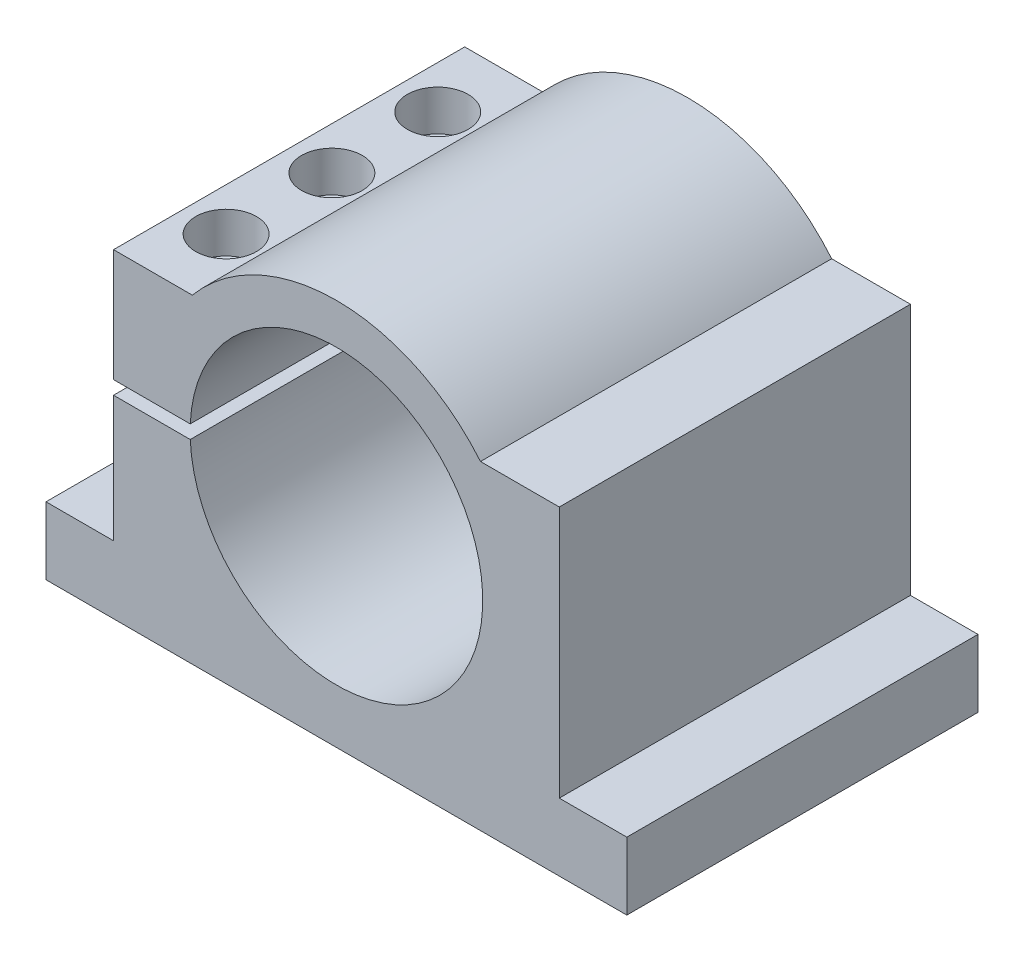
ISO-10303-21;
HEADER;
FILE_DESCRIPTION(('STEP AP214'),'2;1');
FILE_NAME('part.step','',(''),(''),'','','');
FILE_SCHEMA(('AUTOMOTIVE_DESIGN { 1 0 10303 214 1 1 1 1 }'));
ENDSEC;
DATA;
#1=APPLICATION_CONTEXT('core data for automotive mechanical design processes');
#2=APPLICATION_PROTOCOL_DEFINITION('international standard','automotive_design',2000,#1);
#3=PRODUCT_CONTEXT('',#1,'mechanical');
#4=PRODUCT('Part','Part','',(#3));
#5=PRODUCT_RELATED_PRODUCT_CATEGORY('part','',(#4));
#6=PRODUCT_DEFINITION_FORMATION('','',#4);
#7=PRODUCT_DEFINITION_CONTEXT('part definition',#1,'design');
#8=PRODUCT_DEFINITION('design','',#6,#7);
#9=PRODUCT_DEFINITION_SHAPE('','',#8);
#10=(LENGTH_UNIT() NAMED_UNIT(*) SI_UNIT(.MILLI.,.METRE.));
#11=(NAMED_UNIT(*) PLANE_ANGLE_UNIT() SI_UNIT($,.RADIAN.));
#12=(NAMED_UNIT(*) SI_UNIT($,.STERADIAN.) SOLID_ANGLE_UNIT());
#13=UNCERTAINTY_MEASURE_WITH_UNIT(LENGTH_MEASURE(1.E-05),#10,'distance_accuracy_value','');
#14=(GEOMETRIC_REPRESENTATION_CONTEXT(3) GLOBAL_UNCERTAINTY_ASSIGNED_CONTEXT((#13)) GLOBAL_UNIT_ASSIGNED_CONTEXT((#10,
#11,#12)) REPRESENTATION_CONTEXT('',''));
#15=CARTESIAN_POINT('',(0.,0.,0.));
#16=DIRECTION('',(0.,0.,1.));
#17=DIRECTION('',(1.,0.,0.));
#18=AXIS2_PLACEMENT_3D('',#15,#16,#17);
#19=CARTESIAN_POINT('',(-64.5,0.,78.));
#20=DIRECTION('',(1.,0.,0.));
#21=DIRECTION('',(0.,0.,-1.));
#22=AXIS2_PLACEMENT_3D('',#19,#20,#21);
#23=PLANE('',#22);
#24=DIRECTION('',(0.,-1.,0.));
#25=VECTOR('',#24,1.);
#26=CARTESIAN_POINT('',(-64.5,0.,0.));
#27=LINE('',#26,#25);
#28=CARTESIAN_POINT('',(-64.5,15.,0.));
#29=VERTEX_POINT('',#28);
#30=CARTESIAN_POINT('',(-64.5,0.,0.));
#31=VERTEX_POINT('',#30);
#32=EDGE_CURVE('E174',#29,#31,#27,.T.);
#33=ORIENTED_EDGE('',*,*,#32,.T.);
#34=DIRECTION('',(0.,0.,-1.));
#35=VECTOR('',#34,1.);
#36=CARTESIAN_POINT('',(-64.5,0.,78.));
#37=LINE('',#36,#35);
#38=CARTESIAN_POINT('',(-64.5,0.,78.));
#39=VERTEX_POINT('',#38);
#40=EDGE_CURVE('E11',#39,#31,#37,.T.);
#41=ORIENTED_EDGE('',*,*,#40,.F.);
#42=DIRECTION('',(0.,-1.,0.));
#43=VECTOR('',#42,1.);
#44=CARTESIAN_POINT('',(-64.5,0.,78.));
#45=LINE('',#44,#43);
#46=CARTESIAN_POINT('',(-64.5,15.,78.));
#47=VERTEX_POINT('',#46);
#48=EDGE_CURVE('E201',#47,#39,#45,.T.);
#49=ORIENTED_EDGE('',*,*,#48,.F.);
#50=DIRECTION('',(0.,0.,-1.));
#51=VECTOR('',#50,1.);
#52=CARTESIAN_POINT('',(-64.5,15.,78.));
#53=LINE('',#52,#51);
#54=EDGE_CURVE('E170',#47,#29,#53,.T.);
#55=ORIENTED_EDGE('',*,*,#54,.T.);
#56=EDGE_LOOP('',(#33,#41,#49,#55));
#57=FACE_BOUND('',#56,.T.);
#58=ADVANCED_FACE('F38',(#57),#23,.F.);
#59=CARTESIAN_POINT('',(-64.5,0.,78.));
#60=DIRECTION('',(0.,1.,0.));
#61=DIRECTION('',(-1.,0.,0.));
#62=AXIS2_PLACEMENT_3D('',#59,#60,#61);
#63=PLANE('',#62);
#64=DIRECTION('',(1.,0.,0.));
#65=VECTOR('',#64,1.);
#66=CARTESIAN_POINT('',(-64.5,0.,0.));
#67=LINE('',#66,#65);
#68=CARTESIAN_POINT('',(64.5,0.,0.));
#69=VERTEX_POINT('',#68);
#70=EDGE_CURVE('E177',#31,#69,#67,.T.);
#71=ORIENTED_EDGE('',*,*,#70,.T.);
#72=DIRECTION('',(0.,0.,-1.));
#73=VECTOR('',#72,1.);
#74=CARTESIAN_POINT('',(64.5,0.,78.));
#75=LINE('',#74,#73);
#76=CARTESIAN_POINT('',(64.5,0.,78.));
#77=VERTEX_POINT('',#76);
#78=EDGE_CURVE('E47',#77,#69,#75,.T.);
#79=ORIENTED_EDGE('',*,*,#78,.F.);
#80=DIRECTION('',(1.,0.,0.));
#81=VECTOR('',#80,1.);
#82=CARTESIAN_POINT('',(-64.5,0.,78.));
#83=LINE('',#82,#81);
#84=EDGE_CURVE('E117',#39,#77,#83,.T.);
#85=ORIENTED_EDGE('',*,*,#84,.F.);
#86=ORIENTED_EDGE('',*,*,#40,.T.);
#87=EDGE_LOOP('',(#71,#79,#85,#86));
#88=FACE_BOUND('',#87,.T.);
#89=ADVANCED_FACE('F290',(#88),#63,.F.);
#90=CARTESIAN_POINT('',(64.5,0.,78.));
#91=DIRECTION('',(-1.,0.,0.));
#92=DIRECTION('',(0.,0.,1.));
#93=AXIS2_PLACEMENT_3D('',#90,#91,#92);
#94=PLANE('',#93);
#95=DIRECTION('',(0.,1.,0.));
#96=VECTOR('',#95,1.);
#97=CARTESIAN_POINT('',(64.5,0.,0.));
#98=LINE('',#97,#96);
#99=CARTESIAN_POINT('',(64.5,15.,0.));
#100=VERTEX_POINT('',#99);
#101=EDGE_CURVE('E180',#69,#100,#98,.T.);
#102=ORIENTED_EDGE('',*,*,#101,.T.);
#103=DIRECTION('',(0.,0.,-1.));
#104=VECTOR('',#103,1.);
#105=CARTESIAN_POINT('',(64.5,15.,78.));
#106=LINE('',#105,#104);
#107=CARTESIAN_POINT('',(64.5,15.,78.));
#108=VERTEX_POINT('',#107);
#109=EDGE_CURVE('E226',#108,#100,#106,.T.);
#110=ORIENTED_EDGE('',*,*,#109,.F.);
#111=DIRECTION('',(0.,1.,0.));
#112=VECTOR('',#111,1.);
#113=CARTESIAN_POINT('',(64.5,0.,78.));
#114=LINE('',#113,#112);
#115=EDGE_CURVE('E235',#77,#108,#114,.T.);
#116=ORIENTED_EDGE('',*,*,#115,.F.);
#117=ORIENTED_EDGE('',*,*,#78,.T.);
#118=EDGE_LOOP('',(#102,#110,#116,#117));
#119=FACE_BOUND('',#118,.T.);
#120=ADVANCED_FACE('F233',(#119),#94,.F.);
#121=CARTESIAN_POINT('',(64.5,15.,78.));
#122=DIRECTION('',(0.,-1.,0.));
#123=DIRECTION('',(1.,0.,0.));
#124=AXIS2_PLACEMENT_3D('',#121,#122,#123);
#125=PLANE('',#124);
#126=DIRECTION('',(-1.,0.,0.));
#127=VECTOR('',#126,1.);
#128=CARTESIAN_POINT('',(64.5,15.,0.));
#129=LINE('',#128,#127);
#130=CARTESIAN_POINT('',(49.5,15.,0.));
#131=VERTEX_POINT('',#130);
#132=EDGE_CURVE('E182',#100,#131,#129,.T.);
#133=ORIENTED_EDGE('',*,*,#132,.T.);
#134=DIRECTION('',(0.,0.,-1.));
#135=VECTOR('',#134,1.);
#136=CARTESIAN_POINT('',(49.5,15.,78.));
#137=LINE('',#136,#135);
#138=CARTESIAN_POINT('',(49.5,15.,78.));
#139=VERTEX_POINT('',#138);
#140=EDGE_CURVE('E223',#139,#131,#137,.T.);
#141=ORIENTED_EDGE('',*,*,#140,.F.);
#142=DIRECTION('',(-1.,0.,0.));
#143=VECTOR('',#142,1.);
#144=CARTESIAN_POINT('',(64.5,15.,78.));
#145=LINE('',#144,#143);
#146=EDGE_CURVE('E253',#108,#139,#145,.T.);
#147=ORIENTED_EDGE('',*,*,#146,.F.);
#148=ORIENTED_EDGE('',*,*,#109,.T.);
#149=EDGE_LOOP('',(#133,#141,#147,#148));
#150=FACE_BOUND('',#149,.T.);
#151=ADVANCED_FACE('F244',(#150),#125,.F.);
#152=CARTESIAN_POINT('',(49.5,15.,78.));
#153=DIRECTION('',(-1.,0.,0.));
#154=DIRECTION('',(0.,-1.,0.));
#155=AXIS2_PLACEMENT_3D('',#152,#153,#154);
#156=PLANE('',#155);
#157=DIRECTION('',(0.,1.,0.));
#158=VECTOR('',#157,1.);
#159=CARTESIAN_POINT('',(49.5,15.,0.));
#160=LINE('',#159,#158);
#161=CARTESIAN_POINT('',(49.5,71.,0.));
#162=VERTEX_POINT('',#161);
#163=EDGE_CURVE('E184',#131,#162,#160,.T.);
#164=ORIENTED_EDGE('',*,*,#163,.T.);
#165=DIRECTION('',(0.,0.,-1.));
#166=VECTOR('',#165,1.);
#167=CARTESIAN_POINT('',(49.5,71.,78.));
#168=LINE('',#167,#166);
#169=CARTESIAN_POINT('',(49.5,71.,78.));
#170=VERTEX_POINT('',#169);
#171=EDGE_CURVE('E220',#170,#162,#168,.T.);
#172=ORIENTED_EDGE('',*,*,#171,.F.);
#173=DIRECTION('',(0.,1.,0.));
#174=VECTOR('',#173,1.);
#175=CARTESIAN_POINT('',(49.5,15.,78.));
#176=LINE('',#175,#174);
#177=EDGE_CURVE('E250',#139,#170,#176,.T.);
#178=ORIENTED_EDGE('',*,*,#177,.F.);
#179=ORIENTED_EDGE('',*,*,#140,.T.);
#180=EDGE_LOOP('',(#164,#172,#178,#179));
#181=FACE_BOUND('',#180,.T.);
#182=ADVANCED_FACE('F248',(#181),#156,.F.);
#183=CARTESIAN_POINT('',(49.5,71.,78.));
#184=DIRECTION('',(0.,-1.,0.));
#185=DIRECTION('',(0.,0.,-1.));
#186=AXIS2_PLACEMENT_3D('',#183,#184,#185);
#187=PLANE('',#186);
#188=DIRECTION('',(-1.,0.,0.));
#189=VECTOR('',#188,1.);
#190=CARTESIAN_POINT('',(49.5,71.,0.));
#191=LINE('',#190,#189);
#192=CARTESIAN_POINT('',(32.,71.,0.));
#193=VERTEX_POINT('',#192);
#194=EDGE_CURVE('E186',#162,#193,#191,.T.);
#195=ORIENTED_EDGE('',*,*,#194,.T.);
#196=DIRECTION('',(0.,0.,-1.));
#197=VECTOR('',#196,1.);
#198=CARTESIAN_POINT('',(32.,71.,78.));
#199=LINE('',#198,#197);
#200=CARTESIAN_POINT('',(32.,71.,78.));
#201=VERTEX_POINT('',#200);
#202=EDGE_CURVE('E217',#201,#193,#199,.T.);
#203=ORIENTED_EDGE('',*,*,#202,.F.);
#204=DIRECTION('',(-1.,0.,0.));
#205=VECTOR('',#204,1.);
#206=CARTESIAN_POINT('',(49.5,71.,78.));
#207=LINE('',#206,#205);
#208=EDGE_CURVE('E252',#170,#201,#207,.T.);
#209=ORIENTED_EDGE('',*,*,#208,.F.);
#210=ORIENTED_EDGE('',*,*,#171,.T.);
#211=EDGE_LOOP('',(#195,#203,#209,#210));
#212=FACE_BOUND('',#211,.T.);
#213=ADVANCED_FACE('F303',(#212),#187,.F.);
#214=CARTESIAN_POINT('',(0.,44.3666666666666,78.));
#215=DIRECTION('',(0.,0.,-1.));
#216=DIRECTION('',(-1.,0.,0.));
#217=AXIS2_PLACEMENT_3D('',#214,#215,#216);
#218=CYLINDRICAL_SURFACE('',#217,41.6333333333334);
#219=CARTESIAN_POINT('',(0.,44.3666666666666,0.));
#220=DIRECTION('',(0.,0.,1.));
#221=DIRECTION('',(-1.,0.,0.));
#222=AXIS2_PLACEMENT_3D('',#219,#220,#221);
#223=CIRCLE('',#222,41.6333333333334);
#224=CARTESIAN_POINT('',(-32.,71.,0.));
#225=VERTEX_POINT('',#224);
#226=EDGE_CURVE('E188',#193,#225,#223,.T.);
#227=ORIENTED_EDGE('',*,*,#226,.T.);
#228=DIRECTION('',(0.,0.,-1.));
#229=VECTOR('',#228,1.);
#230=CARTESIAN_POINT('',(-32.,71.,78.));
#231=LINE('',#230,#229);
#232=CARTESIAN_POINT('',(-32.,71.,78.));
#233=VERTEX_POINT('',#232);
#234=EDGE_CURVE('E214',#233,#225,#231,.T.);
#235=ORIENTED_EDGE('',*,*,#234,.F.);
#236=CARTESIAN_POINT('',(0.,44.3666666666666,78.));
#237=DIRECTION('',(0.,0.,1.));
#238=DIRECTION('',(-1.,0.,0.));
#239=AXIS2_PLACEMENT_3D('',#236,#237,#238);
#240=CIRCLE('',#239,41.6333333333334);
#241=EDGE_CURVE('E255',#201,#233,#240,.T.);
#242=ORIENTED_EDGE('',*,*,#241,.F.);
#243=ORIENTED_EDGE('',*,*,#202,.T.);
#244=EDGE_LOOP('',(#227,#235,#242,#243));
#245=FACE_BOUND('',#244,.T.);
#246=ADVANCED_FACE('F306',(#245),#218,.T.);
#247=CARTESIAN_POINT('',(-49.5,71.,78.));
#248=DIRECTION('',(0.,-1.,0.));
#249=DIRECTION('',(0.,0.,-1.));
#250=AXIS2_PLACEMENT_3D('',#247,#248,#249);
#251=PLANE('',#250);
#252=CARTESIAN_POINT('',(-40.,71.,15.5));
#253=DIRECTION('',(0.,1.,0.));
#254=DIRECTION('',(0.,0.,1.));
#255=AXIS2_PLACEMENT_3D('',#252,#253,#254);
#256=CIRCLE('',#255,6.74999999999999);
#257=CARTESIAN_POINT('',(-40.,71.,22.25));
#258=VERTEX_POINT('',#257);
#259=EDGE_CURVE('E348',#258,#258,#256,.T.);
#260=ORIENTED_EDGE('',*,*,#259,.F.);
#261=EDGE_LOOP('',(#260));
#262=FACE_BOUND('',#261,.T.);
#263=CARTESIAN_POINT('',(-40.,71.,39.));
#264=DIRECTION('',(0.,1.,0.));
#265=DIRECTION('',(0.,0.,1.));
#266=AXIS2_PLACEMENT_3D('',#263,#264,#265);
#267=CIRCLE('',#266,6.74999999999999);
#268=CARTESIAN_POINT('',(-40.,71.,45.75));
#269=VERTEX_POINT('',#268);
#270=EDGE_CURVE('E357',#269,#269,#267,.T.);
#271=ORIENTED_EDGE('',*,*,#270,.F.);
#272=EDGE_LOOP('',(#271));
#273=FACE_BOUND('',#272,.T.);
#274=CARTESIAN_POINT('',(-40.,71.,62.5));
#275=DIRECTION('',(0.,1.,0.));
#276=DIRECTION('',(0.,0.,1.));
#277=AXIS2_PLACEMENT_3D('',#274,#275,#276);
#278=CIRCLE('',#277,6.74999999999999);
#279=CARTESIAN_POINT('',(-40.,71.,69.25));
#280=VERTEX_POINT('',#279);
#281=EDGE_CURVE('E178',#280,#280,#278,.T.);
#282=ORIENTED_EDGE('',*,*,#281,.F.);
#283=EDGE_LOOP('',(#282));
#284=FACE_BOUND('',#283,.T.);
#285=DIRECTION('',(-1.,0.,0.));
#286=VECTOR('',#285,1.);
#287=CARTESIAN_POINT('',(-49.5,71.,0.));
#288=LINE('',#287,#286);
#289=CARTESIAN_POINT('',(-49.5,71.,0.));
#290=VERTEX_POINT('',#289);
#291=EDGE_CURVE('E190',#225,#290,#288,.T.);
#292=ORIENTED_EDGE('',*,*,#291,.T.);
#293=DIRECTION('',(0.,0.,-1.));
#294=VECTOR('',#293,1.);
#295=CARTESIAN_POINT('',(-49.5,71.,78.));
#296=LINE('',#295,#294);
#297=CARTESIAN_POINT('',(-49.5,71.,78.));
#298=VERTEX_POINT('',#297);
#299=EDGE_CURVE('E211',#298,#290,#296,.T.);
#300=ORIENTED_EDGE('',*,*,#299,.F.);
#301=DIRECTION('',(-1.,0.,0.));
#302=VECTOR('',#301,1.);
#303=CARTESIAN_POINT('',(-49.5,71.,78.));
#304=LINE('',#303,#302);
#305=EDGE_CURVE('E261',#233,#298,#304,.T.);
#306=ORIENTED_EDGE('',*,*,#305,.F.);
#307=ORIENTED_EDGE('',*,*,#234,.T.);
#308=EDGE_LOOP('',(#292,#300,#306,#307));
#309=FACE_BOUND('',#308,.T.);
#310=ADVANCED_FACE('F310',(#262,#273,#284,#309),#251,.F.);
#311=CARTESIAN_POINT('',(-49.5,46.,78.));
#312=DIRECTION('',(1.,0.,0.));
#313=DIRECTION('',(0.,1.,0.));
#314=AXIS2_PLACEMENT_3D('',#311,#312,#313);
#315=PLANE('',#314);
#316=DIRECTION('',(0.,-1.,0.));
#317=VECTOR('',#316,1.);
#318=CARTESIAN_POINT('',(-49.5,46.,0.));
#319=LINE('',#318,#317);
#320=CARTESIAN_POINT('',(-49.5,46.,0.));
#321=VERTEX_POINT('',#320);
#322=EDGE_CURVE('E192',#290,#321,#319,.T.);
#323=ORIENTED_EDGE('',*,*,#322,.T.);
#324=DIRECTION('',(0.,0.,-1.));
#325=VECTOR('',#324,1.);
#326=CARTESIAN_POINT('',(-49.5,46.,78.));
#327=LINE('',#326,#325);
#328=CARTESIAN_POINT('',(-49.5,46.,78.));
#329=VERTEX_POINT('',#328);
#330=EDGE_CURVE('E208',#329,#321,#327,.T.);
#331=ORIENTED_EDGE('',*,*,#330,.F.);
#332=DIRECTION('',(0.,-1.,0.));
#333=VECTOR('',#332,1.);
#334=CARTESIAN_POINT('',(-49.5,46.,78.));
#335=LINE('',#334,#333);
#336=EDGE_CURVE('E263',#298,#329,#335,.T.);
#337=ORIENTED_EDGE('',*,*,#336,.F.);
#338=ORIENTED_EDGE('',*,*,#299,.T.);
#339=EDGE_LOOP('',(#323,#331,#337,#338));
#340=FACE_BOUND('',#339,.T.);
#341=ADVANCED_FACE('F314',(#340),#315,.F.);
#342=CARTESIAN_POINT('',(-49.5,46.,78.));
#343=DIRECTION('',(0.,1.,0.));
#344=DIRECTION('',(0.,0.,1.));
#345=AXIS2_PLACEMENT_3D('',#342,#343,#344);
#346=PLANE('',#345);
#347=CARTESIAN_POINT('',(-40.,46.,15.5));
#348=DIRECTION('',(0.,-1.,0.));
#349=DIRECTION('',(0.,0.,-1.));
#350=AXIS2_PLACEMENT_3D('',#347,#348,#349);
#351=CIRCLE('',#350,4.5);
#352=CARTESIAN_POINT('',(-40.,46.,11.));
#353=VERTEX_POINT('',#352);
#354=EDGE_CURVE('E443',#353,#353,#351,.T.);
#355=ORIENTED_EDGE('',*,*,#354,.F.);
#356=EDGE_LOOP('',(#355));
#357=FACE_BOUND('',#356,.T.);
#358=CARTESIAN_POINT('',(-40.,46.,39.));
#359=DIRECTION('',(0.,1.,0.));
#360=DIRECTION('',(0.,0.,1.));
#361=AXIS2_PLACEMENT_3D('',#358,#359,#360);
#362=CIRCLE('',#361,3.39999999999999);
#363=CARTESIAN_POINT('',(-40.,46.,42.4));
#364=VERTEX_POINT('',#363);
#365=EDGE_CURVE('E456',#364,#364,#362,.T.);
#366=ORIENTED_EDGE('',*,*,#365,.T.);
#367=EDGE_LOOP('',(#366));
#368=FACE_BOUND('',#367,.T.);
#369=CARTESIAN_POINT('',(-40.,46.,62.5));
#370=DIRECTION('',(0.,-1.,0.));
#371=DIRECTION('',(0.,0.,-1.));
#372=AXIS2_PLACEMENT_3D('',#369,#370,#371);
#373=CIRCLE('',#372,4.5);
#374=CARTESIAN_POINT('',(-40.,46.,58.));
#375=VERTEX_POINT('',#374);
#376=EDGE_CURVE('E342',#375,#375,#373,.T.);
#377=ORIENTED_EDGE('',*,*,#376,.F.);
#378=EDGE_LOOP('',(#377));
#379=FACE_BOUND('',#378,.T.);
#380=DIRECTION('',(1.,0.,0.));
#381=VECTOR('',#380,1.);
#382=CARTESIAN_POINT('',(-49.5,46.,0.));
#383=LINE('',#382,#381);
#384=CARTESIAN_POINT('',(-32.4653661614959,46.,0.));
#385=VERTEX_POINT('',#384);
#386=EDGE_CURVE('E194',#321,#385,#383,.T.);
#387=ORIENTED_EDGE('',*,*,#386,.T.);
#388=DIRECTION('',(0.,0.,-1.));
#389=VECTOR('',#388,1.);
#390=CARTESIAN_POINT('',(-32.4653661614959,46.,78.));
#391=LINE('',#390,#389);
#392=CARTESIAN_POINT('',(-32.4653661614959,46.,78.));
#393=VERTEX_POINT('',#392);
#394=EDGE_CURVE('E205',#393,#385,#391,.T.);
#395=ORIENTED_EDGE('',*,*,#394,.F.);
#396=DIRECTION('',(1.,0.,0.));
#397=VECTOR('',#396,1.);
#398=CARTESIAN_POINT('',(-49.5,46.,78.));
#399=LINE('',#398,#397);
#400=EDGE_CURVE('E265',#329,#393,#399,.T.);
#401=ORIENTED_EDGE('',*,*,#400,.F.);
#402=ORIENTED_EDGE('',*,*,#330,.T.);
#403=EDGE_LOOP('',(#387,#395,#401,#402));
#404=FACE_BOUND('',#403,.T.);
#405=ADVANCED_FACE('F271',(#357,#368,#379,#404),#346,.F.);
#406=CARTESIAN_POINT('',(0.,44.5,78.));
#407=DIRECTION('',(0.,0.,-1.));
#408=DIRECTION('',(-1.,0.,0.));
#409=AXIS2_PLACEMENT_3D('',#406,#407,#408);
#410=CYLINDRICAL_SURFACE('',#409,32.5);
#411=CARTESIAN_POINT('',(0.,44.5,0.));
#412=DIRECTION('',(0.,0.,-1.));
#413=DIRECTION('',(1.,0.,0.));
#414=AXIS2_PLACEMENT_3D('',#411,#412,#413);
#415=CIRCLE('',#414,32.5);
#416=CARTESIAN_POINT('',(-32.4653661614959,43.,0.));
#417=VERTEX_POINT('',#416);
#418=EDGE_CURVE('E196',#385,#417,#415,.T.);
#419=ORIENTED_EDGE('',*,*,#418,.T.);
#420=DIRECTION('',(0.,0.,-1.));
#421=VECTOR('',#420,1.);
#422=CARTESIAN_POINT('',(-32.4653661614959,43.,78.));
#423=LINE('',#422,#421);
#424=CARTESIAN_POINT('',(-32.4653661614959,43.,78.));
#425=VERTEX_POINT('',#424);
#426=EDGE_CURVE('E165',#425,#417,#423,.T.);
#427=ORIENTED_EDGE('',*,*,#426,.F.);
#428=CARTESIAN_POINT('',(0.,44.5,78.));
#429=DIRECTION('',(0.,0.,-1.));
#430=DIRECTION('',(1.,0.,0.));
#431=AXIS2_PLACEMENT_3D('',#428,#429,#430);
#432=CIRCLE('',#431,32.5);
#433=EDGE_CURVE('E156',#393,#425,#432,.T.);
#434=ORIENTED_EDGE('',*,*,#433,.F.);
#435=ORIENTED_EDGE('',*,*,#394,.T.);
#436=EDGE_LOOP('',(#419,#427,#434,#435));
#437=FACE_BOUND('',#436,.T.);
#438=ADVANCED_FACE('F275',(#437),#410,.F.);
#439=CARTESIAN_POINT('',(-49.5,43.,78.));
#440=DIRECTION('',(0.,-1.,0.));
#441=DIRECTION('',(0.,0.,-1.));
#442=AXIS2_PLACEMENT_3D('',#439,#440,#441);
#443=PLANE('',#442);
#444=CARTESIAN_POINT('',(-40.,43.,15.5));
#445=DIRECTION('',(0.,1.,0.));
#446=DIRECTION('',(0.,0.,1.));
#447=AXIS2_PLACEMENT_3D('',#444,#445,#446);
#448=CIRCLE('',#447,3.39999999999999);
#449=CARTESIAN_POINT('',(-40.,43.,18.9));
#450=VERTEX_POINT('',#449);
#451=EDGE_CURVE('E331',#450,#450,#448,.T.);
#452=ORIENTED_EDGE('',*,*,#451,.F.);
#453=EDGE_LOOP('',(#452));
#454=FACE_BOUND('',#453,.T.);
#455=CARTESIAN_POINT('',(-40.,43.,62.5));
#456=DIRECTION('',(0.,1.,0.));
#457=DIRECTION('',(0.,0.,1.));
#458=AXIS2_PLACEMENT_3D('',#455,#456,#457);
#459=CIRCLE('',#458,3.39999999999999);
#460=CARTESIAN_POINT('',(-40.,43.,65.9));
#461=VERTEX_POINT('',#460);
#462=EDGE_CURVE('E334',#461,#461,#459,.T.);
#463=ORIENTED_EDGE('',*,*,#462,.F.);
#464=EDGE_LOOP('',(#463));
#465=FACE_BOUND('',#464,.T.);
#466=DIRECTION('',(-1.,0.,0.));
#467=VECTOR('',#466,1.);
#468=CARTESIAN_POINT('',(-49.5,43.,0.));
#469=LINE('',#468,#467);
#470=CARTESIAN_POINT('',(-49.5,43.,0.));
#471=VERTEX_POINT('',#470);
#472=EDGE_CURVE('E164',#417,#471,#469,.T.);
#473=ORIENTED_EDGE('',*,*,#472,.T.);
#474=DIRECTION('',(0.,0.,-1.));
#475=VECTOR('',#474,1.);
#476=CARTESIAN_POINT('',(-49.5,43.,78.));
#477=LINE('',#476,#475);
#478=CARTESIAN_POINT('',(-49.5,43.,78.));
#479=VERTEX_POINT('',#478);
#480=EDGE_CURVE('E161',#479,#471,#477,.T.);
#481=ORIENTED_EDGE('',*,*,#480,.F.);
#482=DIRECTION('',(-1.,0.,0.));
#483=VECTOR('',#482,1.);
#484=CARTESIAN_POINT('',(-49.5,43.,78.));
#485=LINE('',#484,#483);
#486=EDGE_CURVE('E150',#425,#479,#485,.T.);
#487=ORIENTED_EDGE('',*,*,#486,.F.);
#488=ORIENTED_EDGE('',*,*,#426,.T.);
#489=EDGE_LOOP('',(#473,#481,#487,#488));
#490=FACE_BOUND('',#489,.T.);
#491=ADVANCED_FACE('F162',(#454,#465,#490),#443,.F.);
#492=CARTESIAN_POINT('',(-49.5,15.,78.));
#493=DIRECTION('',(1.,0.,0.));
#494=DIRECTION('',(0.,1.,0.));
#495=AXIS2_PLACEMENT_3D('',#492,#493,#494);
#496=PLANE('',#495);
#497=DIRECTION('',(0.,-1.,0.));
#498=VECTOR('',#497,1.);
#499=CARTESIAN_POINT('',(-49.5,15.,0.));
#500=LINE('',#499,#498);
#501=CARTESIAN_POINT('',(-49.5,15.,0.));
#502=VERTEX_POINT('',#501);
#503=EDGE_CURVE('E103',#471,#502,#500,.T.);
#504=ORIENTED_EDGE('',*,*,#503,.T.);
#505=DIRECTION('',(0.,0.,-1.));
#506=VECTOR('',#505,1.);
#507=CARTESIAN_POINT('',(-49.5,15.,78.));
#508=LINE('',#507,#506);
#509=CARTESIAN_POINT('',(-49.5,15.,78.));
#510=VERTEX_POINT('',#509);
#511=EDGE_CURVE('E166',#510,#502,#508,.T.);
#512=ORIENTED_EDGE('',*,*,#511,.F.);
#513=DIRECTION('',(0.,-1.,0.));
#514=VECTOR('',#513,1.);
#515=CARTESIAN_POINT('',(-49.5,15.,78.));
#516=LINE('',#515,#514);
#517=EDGE_CURVE('E154',#479,#510,#516,.T.);
#518=ORIENTED_EDGE('',*,*,#517,.F.);
#519=ORIENTED_EDGE('',*,*,#480,.T.);
#520=EDGE_LOOP('',(#504,#512,#518,#519));
#521=FACE_BOUND('',#520,.T.);
#522=ADVANCED_FACE('F168',(#521),#496,.F.);
#523=CARTESIAN_POINT('',(-64.5,15.,78.));
#524=DIRECTION('',(0.,-1.,0.));
#525=DIRECTION('',(0.,0.,-1.));
#526=AXIS2_PLACEMENT_3D('',#523,#524,#525);
#527=PLANE('',#526);
#528=DIRECTION('',(-1.,0.,0.));
#529=VECTOR('',#528,1.);
#530=CARTESIAN_POINT('',(-64.5,15.,0.));
#531=LINE('',#530,#529);
#532=EDGE_CURVE('E109',#502,#29,#531,.T.);
#533=ORIENTED_EDGE('',*,*,#532,.T.);
#534=ORIENTED_EDGE('',*,*,#54,.F.);
#535=DIRECTION('',(-1.,0.,0.));
#536=VECTOR('',#535,1.);
#537=CARTESIAN_POINT('',(-64.5,15.,78.));
#538=LINE('',#537,#536);
#539=EDGE_CURVE('E55',#510,#47,#538,.T.);
#540=ORIENTED_EDGE('',*,*,#539,.F.);
#541=ORIENTED_EDGE('',*,*,#511,.T.);
#542=EDGE_LOOP('',(#533,#534,#540,#541));
#543=FACE_BOUND('',#542,.T.);
#544=ADVANCED_FACE('F279',(#543),#527,.F.);
#545=CARTESIAN_POINT('',(0.,44.5,78.));
#546=DIRECTION('',(0.,0.,1.));
#547=DIRECTION('',(1.,0.,0.));
#548=AXIS2_PLACEMENT_3D('',#545,#546,#547);
#549=PLANE('',#548);
#550=ORIENTED_EDGE('',*,*,#48,.T.);
#551=ORIENTED_EDGE('',*,*,#84,.T.);
#552=ORIENTED_EDGE('',*,*,#115,.T.);
#553=ORIENTED_EDGE('',*,*,#146,.T.);
#554=ORIENTED_EDGE('',*,*,#177,.T.);
#555=ORIENTED_EDGE('',*,*,#208,.T.);
#556=ORIENTED_EDGE('',*,*,#241,.T.);
#557=ORIENTED_EDGE('',*,*,#305,.T.);
#558=ORIENTED_EDGE('',*,*,#336,.T.);
#559=ORIENTED_EDGE('',*,*,#400,.T.);
#560=ORIENTED_EDGE('',*,*,#433,.T.);
#561=ORIENTED_EDGE('',*,*,#486,.T.);
#562=ORIENTED_EDGE('',*,*,#517,.T.);
#563=ORIENTED_EDGE('',*,*,#539,.T.);
#564=EDGE_LOOP('',(#550,#551,#552,#553,#554,#555,#556,#557,#558,#559,#560,#561,#562,#563));
#565=FACE_BOUND('',#564,.T.);
#566=ADVANCED_FACE('F152',(#565),#549,.T.);
#567=CARTESIAN_POINT('',(0.,44.5,0.));
#568=DIRECTION('',(0.,0.,1.));
#569=DIRECTION('',(1.,0.,0.));
#570=AXIS2_PLACEMENT_3D('',#567,#568,#569);
#571=PLANE('',#570);
#572=ORIENTED_EDGE('',*,*,#32,.F.);
#573=ORIENTED_EDGE('',*,*,#532,.F.);
#574=ORIENTED_EDGE('',*,*,#503,.F.);
#575=ORIENTED_EDGE('',*,*,#472,.F.);
#576=ORIENTED_EDGE('',*,*,#418,.F.);
#577=ORIENTED_EDGE('',*,*,#386,.F.);
#578=ORIENTED_EDGE('',*,*,#322,.F.);
#579=ORIENTED_EDGE('',*,*,#291,.F.);
#580=ORIENTED_EDGE('',*,*,#226,.F.);
#581=ORIENTED_EDGE('',*,*,#194,.F.);
#582=ORIENTED_EDGE('',*,*,#163,.F.);
#583=ORIENTED_EDGE('',*,*,#132,.F.);
#584=ORIENTED_EDGE('',*,*,#101,.F.);
#585=ORIENTED_EDGE('',*,*,#70,.F.);
#586=EDGE_LOOP('',(#572,#573,#574,#575,#576,#577,#578,#579,#580,#581,#582,#583,#584,#585));
#587=FACE_BOUND('',#586,.T.);
#588=ADVANCED_FACE('F239',(#587),#571,.F.);
#589=CARTESIAN_POINT('',(-40.,71.,62.5));
#590=DIRECTION('',(0.,1.,0.));
#591=DIRECTION('',(0.,0.,1.));
#592=AXIS2_PLACEMENT_3D('',#589,#590,#591);
#593=CYLINDRICAL_SURFACE('',#592,6.75);
#594=CARTESIAN_POINT('',(-40.,62.,62.5));
#595=DIRECTION('',(0.,1.,0.));
#596=DIRECTION('',(0.,0.,1.));
#597=AXIS2_PLACEMENT_3D('',#594,#595,#596);
#598=CIRCLE('',#597,6.75);
#599=CARTESIAN_POINT('',(-40.,62.,69.25));
#600=VERTEX_POINT('',#599);
#601=EDGE_CURVE('E360',#600,#600,#598,.T.);
#602=ORIENTED_EDGE('',*,*,#601,.F.);
#603=EDGE_LOOP('',(#602));
#604=FACE_BOUND('',#603,.T.);
#605=ORIENTED_EDGE('',*,*,#281,.T.);
#606=EDGE_LOOP('',(#605));
#607=FACE_BOUND('',#606,.T.);
#608=ADVANCED_FACE('F368',(#604,#607),#593,.F.);
#609=CARTESIAN_POINT('',(-40.,62.,62.5));
#610=DIRECTION('',(0.,1.,0.));
#611=DIRECTION('',(0.,0.,1.));
#612=AXIS2_PLACEMENT_3D('',#609,#610,#611);
#613=CONICAL_SURFACE('',#612,6.75000000000001,1.04719755119659);
#614=CARTESIAN_POINT('',(-40.,60.7009618943233,62.5));
#615=DIRECTION('',(0.,1.,0.));
#616=DIRECTION('',(0.,0.,1.));
#617=AXIS2_PLACEMENT_3D('',#614,#615,#616);
#618=CIRCLE('',#617,4.49999999999999);
#619=CARTESIAN_POINT('',(-40.,60.7009618943233,67.));
#620=VERTEX_POINT('',#619);
#621=EDGE_CURVE('E41',#620,#620,#618,.F.);
#622=ORIENTED_EDGE('',*,*,#621,.T.);
#623=EDGE_LOOP('',(#622));
#624=FACE_BOUND('',#623,.T.);
#625=ORIENTED_EDGE('',*,*,#601,.T.);
#626=EDGE_LOOP('',(#625));
#627=FACE_BOUND('',#626,.T.);
#628=ADVANCED_FACE('F380',(#624,#627),#613,.F.);
#629=CARTESIAN_POINT('',(-40.,71.,39.));
#630=DIRECTION('',(0.,1.,0.));
#631=DIRECTION('',(0.,0.,1.));
#632=AXIS2_PLACEMENT_3D('',#629,#630,#631);
#633=CYLINDRICAL_SURFACE('',#632,6.75);
#634=CARTESIAN_POINT('',(-40.,62.,39.));
#635=DIRECTION('',(0.,1.,0.));
#636=DIRECTION('',(0.,0.,1.));
#637=AXIS2_PLACEMENT_3D('',#634,#635,#636);
#638=CIRCLE('',#637,6.75);
#639=CARTESIAN_POINT('',(-40.,62.,45.75));
#640=VERTEX_POINT('',#639);
#641=EDGE_CURVE('E354',#640,#640,#638,.T.);
#642=ORIENTED_EDGE('',*,*,#641,.F.);
#643=EDGE_LOOP('',(#642));
#644=FACE_BOUND('',#643,.T.);
#645=ORIENTED_EDGE('',*,*,#270,.T.);
#646=EDGE_LOOP('',(#645));
#647=FACE_BOUND('',#646,.T.);
#648=ADVANCED_FACE('F387',(#644,#647),#633,.F.);
#649=CARTESIAN_POINT('',(-40.,62.,39.));
#650=DIRECTION('',(0.,1.,0.));
#651=DIRECTION('',(0.,0.,1.));
#652=AXIS2_PLACEMENT_3D('',#649,#650,#651);
#653=CONICAL_SURFACE('',#652,6.75000000000001,1.04719755119659);
#654=CARTESIAN_POINT('',(-40.,60.4122867597285,39.));
#655=DIRECTION('',(0.,1.,0.));
#656=DIRECTION('',(0.,0.,1.));
#657=AXIS2_PLACEMENT_3D('',#654,#655,#656);
#658=CIRCLE('',#657,4.);
#659=CARTESIAN_POINT('',(-40.,60.4122867597285,43.));
#660=VERTEX_POINT('',#659);
#661=EDGE_CURVE('E351',#660,#660,#658,.T.);
#662=ORIENTED_EDGE('',*,*,#661,.F.);
#663=EDGE_LOOP('',(#662));
#664=FACE_BOUND('',#663,.T.);
#665=ORIENTED_EDGE('',*,*,#641,.T.);
#666=EDGE_LOOP('',(#665));
#667=FACE_BOUND('',#666,.T.);
#668=ADVANCED_FACE('F394',(#664,#667),#653,.F.);
#669=CARTESIAN_POINT('',(-40.,60.4122867597285,35.));
#670=DIRECTION('',(0.,-1.,0.));
#671=DIRECTION('',(0.,0.,-1.));
#672=AXIS2_PLACEMENT_3D('',#669,#670,#671);
#673=PLANE('',#672);
#674=CARTESIAN_POINT('',(-40.,60.4122867597285,39.));
#675=DIRECTION('',(0.,1.,0.));
#676=DIRECTION('',(0.,0.,1.));
#677=AXIS2_PLACEMENT_3D('',#674,#675,#676);
#678=CIRCLE('',#677,3.39999999999999);
#679=CARTESIAN_POINT('',(-40.,60.4122867597285,42.4));
#680=VERTEX_POINT('',#679);
#681=EDGE_CURVE('E454',#680,#680,#678,.T.);
#682=ORIENTED_EDGE('',*,*,#681,.F.);
#683=EDGE_LOOP('',(#682));
#684=FACE_BOUND('',#683,.T.);
#685=ORIENTED_EDGE('',*,*,#661,.T.);
#686=EDGE_LOOP('',(#685));
#687=FACE_BOUND('',#686,.T.);
#688=ADVANCED_FACE('F398',(#684,#687),#673,.F.);
#689=CARTESIAN_POINT('',(-40.,71.,15.5));
#690=DIRECTION('',(0.,1.,0.));
#691=DIRECTION('',(0.,0.,1.));
#692=AXIS2_PLACEMENT_3D('',#689,#690,#691);
#693=CYLINDRICAL_SURFACE('',#692,6.75);
#694=CARTESIAN_POINT('',(-40.,62.,15.5));
#695=DIRECTION('',(0.,1.,0.));
#696=DIRECTION('',(0.,0.,1.));
#697=AXIS2_PLACEMENT_3D('',#694,#695,#696);
#698=CIRCLE('',#697,6.75);
#699=CARTESIAN_POINT('',(-40.,62.,22.25));
#700=VERTEX_POINT('',#699);
#701=EDGE_CURVE('E339',#700,#700,#698,.T.);
#702=ORIENTED_EDGE('',*,*,#701,.F.);
#703=EDGE_LOOP('',(#702));
#704=FACE_BOUND('',#703,.T.);
#705=ORIENTED_EDGE('',*,*,#259,.T.);
#706=EDGE_LOOP('',(#705));
#707=FACE_BOUND('',#706,.T.);
#708=ADVANCED_FACE('F402',(#704,#707),#693,.F.);
#709=CARTESIAN_POINT('',(-40.,62.,15.5));
#710=DIRECTION('',(0.,1.,0.));
#711=DIRECTION('',(0.,0.,1.));
#712=AXIS2_PLACEMENT_3D('',#709,#710,#711);
#713=CONICAL_SURFACE('',#712,6.75000000000001,1.04719755119659);
#714=CARTESIAN_POINT('',(-40.,60.7009618943233,15.5));
#715=DIRECTION('',(0.,1.,0.));
#716=DIRECTION('',(0.,0.,1.));
#717=AXIS2_PLACEMENT_3D('',#714,#715,#716);
#718=CIRCLE('',#717,4.49999999999999);
#719=CARTESIAN_POINT('',(-40.,60.7009618943233,20.));
#720=VERTEX_POINT('',#719);
#721=EDGE_CURVE('E446',#720,#720,#718,.F.);
#722=ORIENTED_EDGE('',*,*,#721,.T.);
#723=EDGE_LOOP('',(#722));
#724=FACE_BOUND('',#723,.T.);
#725=ORIENTED_EDGE('',*,*,#701,.T.);
#726=EDGE_LOOP('',(#725));
#727=FACE_BOUND('',#726,.T.);
#728=ADVANCED_FACE('F406',(#724,#727),#713,.F.);
#729=CARTESIAN_POINT('',(-40.,18.,62.5));
#730=DIRECTION('',(0.,1.,0.));
#731=DIRECTION('',(0.,0.,1.));
#732=AXIS2_PLACEMENT_3D('',#729,#730,#731);
#733=CONICAL_SURFACE('',#732,3.39999999999999,1.02974425867665);
#734=CARTESIAN_POINT('',(-40.,15.9570738953063,62.5));
#735=VERTEX_POINT('',#734);
#736=VERTEX_LOOP('',#735);
#737=FACE_BOUND('',#736,.T.);
#738=CARTESIAN_POINT('',(-40.,18.,62.5));
#739=DIRECTION('',(0.,1.,0.));
#740=DIRECTION('',(0.,0.,1.));
#741=AXIS2_PLACEMENT_3D('',#738,#739,#740);
#742=CIRCLE('',#741,3.39999999999999);
#743=CARTESIAN_POINT('',(-40.,18.,65.9));
#744=VERTEX_POINT('',#743);
#745=EDGE_CURVE('E336',#744,#744,#742,.T.);
#746=ORIENTED_EDGE('',*,*,#745,.T.);
#747=EDGE_LOOP('',(#746));
#748=FACE_BOUND('',#747,.T.);
#749=ADVANCED_FACE('F410',(#737,#748),#733,.F.);
#750=CARTESIAN_POINT('',(-40.,43.,62.5));
#751=DIRECTION('',(0.,1.,0.));
#752=DIRECTION('',(0.,0.,1.));
#753=AXIS2_PLACEMENT_3D('',#750,#751,#752);
#754=CYLINDRICAL_SURFACE('',#753,3.39999999999999);
#755=ORIENTED_EDGE('',*,*,#745,.F.);
#756=EDGE_LOOP('',(#755));
#757=FACE_BOUND('',#756,.T.);
#758=ORIENTED_EDGE('',*,*,#462,.T.);
#759=EDGE_LOOP('',(#758));
#760=FACE_BOUND('',#759,.T.);
#761=ADVANCED_FACE('F414',(#757,#760),#754,.F.);
#762=CARTESIAN_POINT('',(-40.,46.,62.5));
#763=DIRECTION('',(0.,-1.,0.));
#764=DIRECTION('',(0.,0.,-1.));
#765=AXIS2_PLACEMENT_3D('',#762,#763,#764);
#766=CYLINDRICAL_SURFACE('',#765,4.49999999999999);
#767=ORIENTED_EDGE('',*,*,#376,.T.);
#768=EDGE_LOOP('',(#767));
#769=FACE_BOUND('',#768,.T.);
#770=ORIENTED_EDGE('',*,*,#621,.F.);
#771=EDGE_LOOP('',(#770));
#772=FACE_BOUND('',#771,.T.);
#773=ADVANCED_FACE('F418',(#769,#772),#766,.F.);
#774=CARTESIAN_POINT('',(-40.,60.4122867597285,39.));
#775=DIRECTION('',(0.,1.,0.));
#776=DIRECTION('',(0.,0.,1.));
#777=AXIS2_PLACEMENT_3D('',#774,#775,#776);
#778=CYLINDRICAL_SURFACE('',#777,3.39999999999999);
#779=ORIENTED_EDGE('',*,*,#365,.F.);
#780=EDGE_LOOP('',(#779));
#781=FACE_BOUND('',#780,.T.);
#782=ORIENTED_EDGE('',*,*,#681,.T.);
#783=EDGE_LOOP('',(#782));
#784=FACE_BOUND('',#783,.T.);
#785=ADVANCED_FACE('F422',(#781,#784),#778,.F.);
#786=CARTESIAN_POINT('',(-40.,18.,15.5));
#787=DIRECTION('',(0.,1.,0.));
#788=DIRECTION('',(0.,0.,1.));
#789=AXIS2_PLACEMENT_3D('',#786,#787,#788);
#790=CONICAL_SURFACE('',#789,3.39999999999999,1.02974425867665);
#791=CARTESIAN_POINT('',(-40.,15.9570738953063,15.5));
#792=VERTEX_POINT('',#791);
#793=VERTEX_LOOP('',#792);
#794=FACE_BOUND('',#793,.T.);
#795=CARTESIAN_POINT('',(-40.,18.,15.5));
#796=DIRECTION('',(0.,1.,0.));
#797=DIRECTION('',(0.,0.,1.));
#798=AXIS2_PLACEMENT_3D('',#795,#796,#797);
#799=CIRCLE('',#798,3.39999999999999);
#800=CARTESIAN_POINT('',(-40.,18.,18.9));
#801=VERTEX_POINT('',#800);
#802=EDGE_CURVE('E448',#801,#801,#799,.T.);
#803=ORIENTED_EDGE('',*,*,#802,.T.);
#804=EDGE_LOOP('',(#803));
#805=FACE_BOUND('',#804,.T.);
#806=ADVANCED_FACE('F426',(#794,#805),#790,.F.);
#807=CARTESIAN_POINT('',(-40.,43.,15.5));
#808=DIRECTION('',(0.,1.,0.));
#809=DIRECTION('',(0.,0.,1.));
#810=AXIS2_PLACEMENT_3D('',#807,#808,#809);
#811=CYLINDRICAL_SURFACE('',#810,3.39999999999999);
#812=ORIENTED_EDGE('',*,*,#802,.F.);
#813=EDGE_LOOP('',(#812));
#814=FACE_BOUND('',#813,.T.);
#815=ORIENTED_EDGE('',*,*,#451,.T.);
#816=EDGE_LOOP('',(#815));
#817=FACE_BOUND('',#816,.T.);
#818=ADVANCED_FACE('F430',(#814,#817),#811,.F.);
#819=CARTESIAN_POINT('',(-40.,46.,15.5));
#820=DIRECTION('',(0.,-1.,0.));
#821=DIRECTION('',(0.,0.,-1.));
#822=AXIS2_PLACEMENT_3D('',#819,#820,#821);
#823=CYLINDRICAL_SURFACE('',#822,4.49999999999999);
#824=ORIENTED_EDGE('',*,*,#354,.T.);
#825=EDGE_LOOP('',(#824));
#826=FACE_BOUND('',#825,.T.);
#827=ORIENTED_EDGE('',*,*,#721,.F.);
#828=EDGE_LOOP('',(#827));
#829=FACE_BOUND('',#828,.T.);
#830=ADVANCED_FACE('F434',(#826,#829),#823,.F.);
#831=CLOSED_SHELL('',(#58,#89,#120,#151,#182,#213,#246,#310,#341,#405,#438,#491,#522,#544,#566,
#588,#608,#628,#648,#668,#688,#708,#728,#749,#761,#773,#785,#806,#818,#830));
#832=MANIFOLD_SOLID_BREP('B2',#831);
#833=ADVANCED_BREP_SHAPE_REPRESENTATION('',(#18,#832),#14);
#834=SHAPE_DEFINITION_REPRESENTATION(#9,#833);
ENDSEC;
END-ISO-10303-21;
